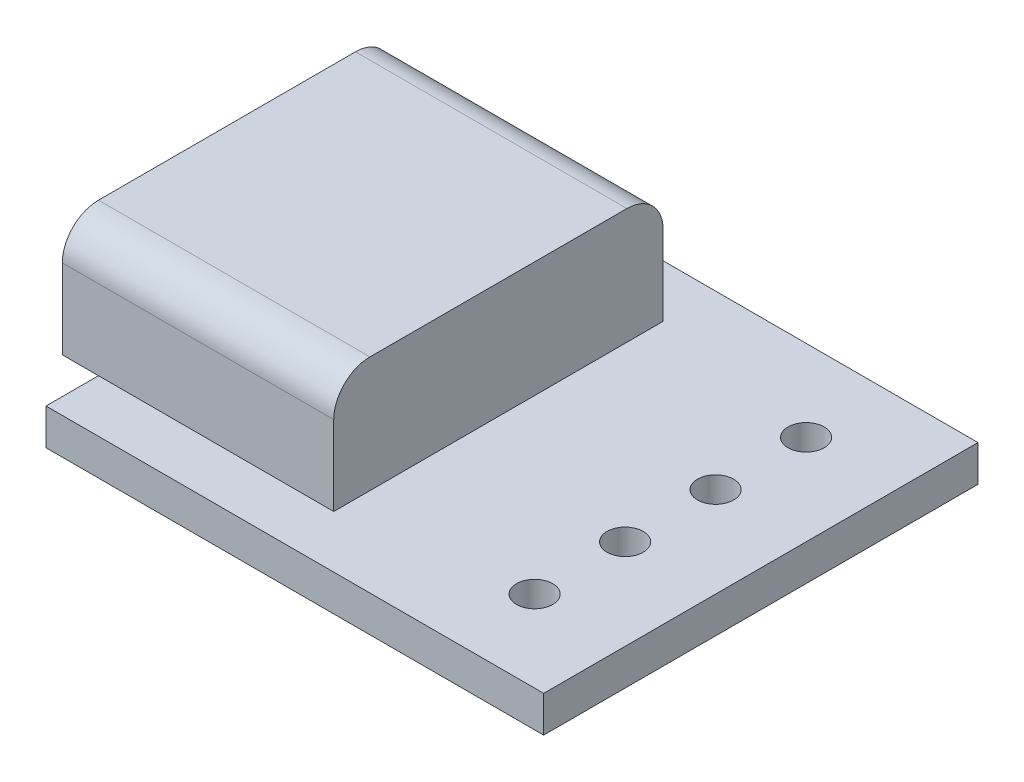
ISO-10303-21;
HEADER;
FILE_DESCRIPTION(('STEP AP214'),'2;1');
FILE_NAME('part.step','',(''),(''),'','','');
FILE_SCHEMA(('AUTOMOTIVE_DESIGN { 1 0 10303 214 1 1 1 1 }'));
ENDSEC;
DATA;
#1=APPLICATION_CONTEXT('core data for automotive mechanical design processes');
#2=APPLICATION_PROTOCOL_DEFINITION('international standard','automotive_design',2000,#1);
#3=PRODUCT_CONTEXT('',#1,'mechanical');
#4=PRODUCT('Part','Part','',(#3));
#5=PRODUCT_RELATED_PRODUCT_CATEGORY('part','',(#4));
#6=PRODUCT_DEFINITION_FORMATION('','',#4);
#7=PRODUCT_DEFINITION_CONTEXT('part definition',#1,'design');
#8=PRODUCT_DEFINITION('design','',#6,#7);
#9=PRODUCT_DEFINITION_SHAPE('','',#8);
#10=(LENGTH_UNIT() NAMED_UNIT(*) SI_UNIT(.MILLI.,.METRE.));
#11=(NAMED_UNIT(*) PLANE_ANGLE_UNIT() SI_UNIT($,.RADIAN.));
#12=(NAMED_UNIT(*) SI_UNIT($,.STERADIAN.) SOLID_ANGLE_UNIT());
#13=UNCERTAINTY_MEASURE_WITH_UNIT(LENGTH_MEASURE(1.E-05),#10,'distance_accuracy_value','');
#14=(GEOMETRIC_REPRESENTATION_CONTEXT(3) GLOBAL_UNCERTAINTY_ASSIGNED_CONTEXT((#13)) GLOBAL_UNIT_ASSIGNED_CONTEXT((#10,
#11,#12)) REPRESENTATION_CONTEXT('',''));
#15=CARTESIAN_POINT('',(0.,0.,0.));
#16=DIRECTION('',(0.,0.,1.));
#17=DIRECTION('',(1.,0.,0.));
#18=AXIS2_PLACEMENT_3D('',#15,#16,#17);
#19=CARTESIAN_POINT('',(0.,1.,-12.));
#20=DIRECTION('',(0.,0.,-1.));
#21=DIRECTION('',(-1.,0.,0.));
#22=AXIS2_PLACEMENT_3D('',#19,#20,#21);
#23=PLANE('',#22);
#24=DIRECTION('',(1.,0.,0.));
#25=VECTOR('',#24,1.);
#26=CARTESIAN_POINT('',(0.,0.,-12.));
#27=LINE('',#26,#25);
#28=CARTESIAN_POINT('',(0.,0.,-12.));
#29=VERTEX_POINT('',#28);
#30=CARTESIAN_POINT('',(13.75,0.,-12.));
#31=VERTEX_POINT('',#30);
#32=EDGE_CURVE('E161',#29,#31,#27,.T.);
#33=ORIENTED_EDGE('',*,*,#32,.F.);
#34=DIRECTION('',(0.,-1.,0.));
#35=VECTOR('',#34,1.);
#36=CARTESIAN_POINT('',(0.,1.,-12.));
#37=LINE('',#36,#35);
#38=CARTESIAN_POINT('',(0.,1.,-12.));
#39=VERTEX_POINT('',#38);
#40=EDGE_CURVE('E141',#39,#29,#37,.T.);
#41=ORIENTED_EDGE('',*,*,#40,.F.);
#42=DIRECTION('',(1.,0.,0.));
#43=VECTOR('',#42,1.);
#44=CARTESIAN_POINT('',(0.,1.,-12.));
#45=LINE('',#44,#43);
#46=CARTESIAN_POINT('',(13.75,1.,-12.));
#47=VERTEX_POINT('',#46);
#48=EDGE_CURVE('E162',#39,#47,#45,.T.);
#49=ORIENTED_EDGE('',*,*,#48,.T.);
#50=DIRECTION('',(0.,-1.,0.));
#51=VECTOR('',#50,1.);
#52=CARTESIAN_POINT('',(13.75,1.,-12.));
#53=LINE('',#52,#51);
#54=EDGE_CURVE('E186',#47,#31,#53,.T.);
#55=ORIENTED_EDGE('',*,*,#54,.T.);
#56=EDGE_LOOP('',(#33,#41,#49,#55));
#57=FACE_BOUND('',#56,.T.);
#58=ADVANCED_FACE('F34',(#57),#23,.T.);
#59=CARTESIAN_POINT('',(0.,1.,0.));
#60=DIRECTION('',(-1.,0.,0.));
#61=DIRECTION('',(0.,0.,1.));
#62=AXIS2_PLACEMENT_3D('',#59,#60,#61);
#63=PLANE('',#62);
#64=DIRECTION('',(0.,0.,-1.));
#65=VECTOR('',#64,1.);
#66=CARTESIAN_POINT('',(0.,0.,0.));
#67=LINE('',#66,#65);
#68=CARTESIAN_POINT('',(0.,0.,0.));
#69=VERTEX_POINT('',#68);
#70=EDGE_CURVE('E189',#69,#29,#67,.T.);
#71=ORIENTED_EDGE('',*,*,#70,.F.);
#72=DIRECTION('',(0.,-1.,0.));
#73=VECTOR('',#72,1.);
#74=CARTESIAN_POINT('',(0.,1.,0.));
#75=LINE('',#74,#73);
#76=CARTESIAN_POINT('',(0.,1.,0.));
#77=VERTEX_POINT('',#76);
#78=EDGE_CURVE('E212',#77,#69,#75,.T.);
#79=ORIENTED_EDGE('',*,*,#78,.F.);
#80=DIRECTION('',(0.,0.,-1.));
#81=VECTOR('',#80,1.);
#82=CARTESIAN_POINT('',(0.,1.,0.));
#83=LINE('',#82,#81);
#84=CARTESIAN_POINT('',(0.,1.,-1.45));
#85=VERTEX_POINT('',#84);
#86=EDGE_CURVE('E166',#77,#85,#83,.T.);
#87=ORIENTED_EDGE('',*,*,#86,.T.);
#88=CARTESIAN_POINT('',(0.,1.,-10.55));
#89=VERTEX_POINT('',#88);
#90=EDGE_CURVE('E170',#85,#89,#83,.T.);
#91=ORIENTED_EDGE('',*,*,#90,.T.);
#92=EDGE_CURVE('E138',#89,#39,#83,.T.);
#93=ORIENTED_EDGE('',*,*,#92,.T.);
#94=ORIENTED_EDGE('',*,*,#40,.T.);
#95=EDGE_LOOP('',(#71,#79,#87,#91,#93,#94));
#96=FACE_BOUND('',#95,.T.);
#97=ADVANCED_FACE('F242',(#96),#63,.T.);
#98=CARTESIAN_POINT('',(0.,1.,0.));
#99=DIRECTION('',(0.,0.,-1.));
#100=DIRECTION('',(-1.,0.,0.));
#101=AXIS2_PLACEMENT_3D('',#98,#99,#100);
#102=PLANE('',#101);
#103=DIRECTION('',(1.,0.,0.));
#104=VECTOR('',#103,1.);
#105=CARTESIAN_POINT('',(0.,0.,0.));
#106=LINE('',#105,#104);
#107=CARTESIAN_POINT('',(13.75,0.,0.));
#108=VERTEX_POINT('',#107);
#109=EDGE_CURVE('E192',#69,#108,#106,.T.);
#110=ORIENTED_EDGE('',*,*,#109,.T.);
#111=DIRECTION('',(0.,-1.,0.));
#112=VECTOR('',#111,1.);
#113=CARTESIAN_POINT('',(13.75,1.,0.));
#114=LINE('',#113,#112);
#115=CARTESIAN_POINT('',(13.75,1.,0.));
#116=VERTEX_POINT('',#115);
#117=EDGE_CURVE('E209',#116,#108,#114,.T.);
#118=ORIENTED_EDGE('',*,*,#117,.F.);
#119=DIRECTION('',(1.,0.,0.));
#120=VECTOR('',#119,1.);
#121=CARTESIAN_POINT('',(0.,1.,0.));
#122=LINE('',#121,#120);
#123=EDGE_CURVE('E169',#77,#116,#122,.T.);
#124=ORIENTED_EDGE('',*,*,#123,.F.);
#125=ORIENTED_EDGE('',*,*,#78,.T.);
#126=EDGE_LOOP('',(#110,#118,#124,#125));
#127=FACE_BOUND('',#126,.T.);
#128=ADVANCED_FACE('F260',(#127),#102,.F.);
#129=CARTESIAN_POINT('',(11.25,1.,-7.25));
#130=DIRECTION('',(0.,-1.,0.));
#131=DIRECTION('',(0.,0.,-1.));
#132=AXIS2_PLACEMENT_3D('',#129,#130,#131);
#133=CYLINDRICAL_SURFACE('',#132,0.500000000000001);
#134=CARTESIAN_POINT('',(11.25,1.,-7.25));
#135=DIRECTION('',(0.,1.,0.));
#136=DIRECTION('',(0.,0.,1.));
#137=AXIS2_PLACEMENT_3D('',#134,#135,#136);
#138=CIRCLE('',#137,0.500000000000001);
#139=CARTESIAN_POINT('',(11.25,1.,-6.75));
#140=VERTEX_POINT('',#139);
#141=EDGE_CURVE('E180',#140,#140,#138,.T.);
#142=ORIENTED_EDGE('',*,*,#141,.T.);
#143=EDGE_LOOP('',(#142));
#144=FACE_BOUND('',#143,.T.);
#145=CARTESIAN_POINT('',(11.25,0.,-7.25));
#146=DIRECTION('',(0.,1.,0.));
#147=DIRECTION('',(0.,0.,1.));
#148=AXIS2_PLACEMENT_3D('',#145,#146,#147);
#149=CIRCLE('',#148,0.500000000000001);
#150=CARTESIAN_POINT('',(11.25,0.,-6.75));
#151=VERTEX_POINT('',#150);
#152=EDGE_CURVE('E203',#151,#151,#149,.T.);
#153=ORIENTED_EDGE('',*,*,#152,.F.);
#154=EDGE_LOOP('',(#153));
#155=FACE_BOUND('',#154,.T.);
#156=ADVANCED_FACE('F262',(#144,#155),#133,.F.);
#157=CARTESIAN_POINT('',(11.2500000000001,1.,-4.75));
#158=DIRECTION('',(0.,-1.,0.));
#159=DIRECTION('',(0.,0.,-1.));
#160=AXIS2_PLACEMENT_3D('',#157,#158,#159);
#161=CYLINDRICAL_SURFACE('',#160,0.500000000000001);
#162=CARTESIAN_POINT('',(11.2500000000001,1.,-4.75));
#163=DIRECTION('',(0.,1.,0.));
#164=DIRECTION('',(0.,0.,1.));
#165=AXIS2_PLACEMENT_3D('',#162,#163,#164);
#166=CIRCLE('',#165,0.500000000000001);
#167=CARTESIAN_POINT('',(11.2500000000001,1.,-4.25));
#168=VERTEX_POINT('',#167);
#169=EDGE_CURVE('E177',#168,#168,#166,.T.);
#170=ORIENTED_EDGE('',*,*,#169,.T.);
#171=EDGE_LOOP('',(#170));
#172=FACE_BOUND('',#171,.T.);
#173=CARTESIAN_POINT('',(11.2500000000001,0.,-4.75));
#174=DIRECTION('',(0.,1.,0.));
#175=DIRECTION('',(0.,0.,1.));
#176=AXIS2_PLACEMENT_3D('',#173,#174,#175);
#177=CIRCLE('',#176,0.500000000000001);
#178=CARTESIAN_POINT('',(11.2500000000001,0.,-4.25));
#179=VERTEX_POINT('',#178);
#180=EDGE_CURVE('E200',#179,#179,#177,.T.);
#181=ORIENTED_EDGE('',*,*,#180,.F.);
#182=EDGE_LOOP('',(#181));
#183=FACE_BOUND('',#182,.T.);
#184=ADVANCED_FACE('F268',(#172,#183),#161,.F.);
#185=CARTESIAN_POINT('',(11.2500000000001,1.,-2.25));
#186=DIRECTION('',(0.,-1.,0.));
#187=DIRECTION('',(0.,0.,-1.));
#188=AXIS2_PLACEMENT_3D('',#185,#186,#187);
#189=CYLINDRICAL_SURFACE('',#188,0.500000000000001);
#190=CARTESIAN_POINT('',(11.2500000000001,1.,-2.25));
#191=DIRECTION('',(0.,1.,0.));
#192=DIRECTION('',(0.,0.,1.));
#193=AXIS2_PLACEMENT_3D('',#190,#191,#192);
#194=CIRCLE('',#193,0.500000000000001);
#195=CARTESIAN_POINT('',(11.2500000000001,1.,-1.75));
#196=VERTEX_POINT('',#195);
#197=EDGE_CURVE('E174',#196,#196,#194,.T.);
#198=ORIENTED_EDGE('',*,*,#197,.T.);
#199=EDGE_LOOP('',(#198));
#200=FACE_BOUND('',#199,.T.);
#201=CARTESIAN_POINT('',(11.2500000000001,0.,-2.25));
#202=DIRECTION('',(0.,1.,0.));
#203=DIRECTION('',(0.,0.,1.));
#204=AXIS2_PLACEMENT_3D('',#201,#202,#203);
#205=CIRCLE('',#204,0.500000000000001);
#206=CARTESIAN_POINT('',(11.2500000000001,0.,-1.75));
#207=VERTEX_POINT('',#206);
#208=EDGE_CURVE('E197',#207,#207,#205,.T.);
#209=ORIENTED_EDGE('',*,*,#208,.F.);
#210=EDGE_LOOP('',(#209));
#211=FACE_BOUND('',#210,.T.);
#212=ADVANCED_FACE('F307',(#200,#211),#189,.F.);
#213=CARTESIAN_POINT('',(13.75,1.,0.));
#214=DIRECTION('',(-1.,0.,0.));
#215=DIRECTION('',(0.,0.,1.));
#216=AXIS2_PLACEMENT_3D('',#213,#214,#215);
#217=PLANE('',#216);
#218=DIRECTION('',(0.,0.,-1.));
#219=VECTOR('',#218,1.);
#220=CARTESIAN_POINT('',(13.75,0.,0.));
#221=LINE('',#220,#219);
#222=EDGE_CURVE('E194',#108,#31,#221,.T.);
#223=ORIENTED_EDGE('',*,*,#222,.T.);
#224=ORIENTED_EDGE('',*,*,#54,.F.);
#225=DIRECTION('',(0.,0.,-1.));
#226=VECTOR('',#225,1.);
#227=CARTESIAN_POINT('',(13.75,1.,0.));
#228=LINE('',#227,#226);
#229=EDGE_CURVE('E172',#116,#47,#228,.T.);
#230=ORIENTED_EDGE('',*,*,#229,.F.);
#231=ORIENTED_EDGE('',*,*,#117,.T.);
#232=EDGE_LOOP('',(#223,#224,#230,#231));
#233=FACE_BOUND('',#232,.T.);
#234=ADVANCED_FACE('F253',(#233),#217,.F.);
#235=CARTESIAN_POINT('',(11.25,1.,-9.75));
#236=DIRECTION('',(0.,-1.,0.));
#237=DIRECTION('',(0.,0.,-1.));
#238=AXIS2_PLACEMENT_3D('',#235,#236,#237);
#239=CYLINDRICAL_SURFACE('',#238,0.500000000000001);
#240=CARTESIAN_POINT('',(11.25,1.,-9.75));
#241=DIRECTION('',(0.,1.,0.));
#242=DIRECTION('',(0.,0.,1.));
#243=AXIS2_PLACEMENT_3D('',#240,#241,#242);
#244=CIRCLE('',#243,0.500000000000001);
#245=CARTESIAN_POINT('',(11.25,1.,-9.25));
#246=VERTEX_POINT('',#245);
#247=EDGE_CURVE('E183',#246,#246,#244,.T.);
#248=ORIENTED_EDGE('',*,*,#247,.T.);
#249=EDGE_LOOP('',(#248));
#250=FACE_BOUND('',#249,.T.);
#251=CARTESIAN_POINT('',(11.25,0.,-9.75));
#252=DIRECTION('',(0.,1.,0.));
#253=DIRECTION('',(0.,0.,1.));
#254=AXIS2_PLACEMENT_3D('',#251,#252,#253);
#255=CIRCLE('',#254,0.500000000000001);
#256=CARTESIAN_POINT('',(11.25,0.,-9.25));
#257=VERTEX_POINT('',#256);
#258=EDGE_CURVE('E165',#257,#257,#255,.T.);
#259=ORIENTED_EDGE('',*,*,#258,.F.);
#260=EDGE_LOOP('',(#259));
#261=FACE_BOUND('',#260,.T.);
#262=ADVANCED_FACE('F299',(#250,#261),#239,.F.);
#263=CARTESIAN_POINT('',(0.,1.,0.));
#264=DIRECTION('',(0.,1.,0.));
#265=DIRECTION('',(0.,0.,1.));
#266=AXIS2_PLACEMENT_3D('',#263,#264,#265);
#267=PLANE('',#266);
#268=DIRECTION('',(1.,0.,0.));
#269=VECTOR('',#268,1.);
#270=CARTESIAN_POINT('',(0.,1.,-1.45));
#271=LINE('',#270,#269);
#272=CARTESIAN_POINT('',(6.5,1.,-1.45));
#273=VERTEX_POINT('',#272);
#274=EDGE_CURVE('E140',#85,#273,#271,.T.);
#275=ORIENTED_EDGE('',*,*,#274,.F.);
#276=ORIENTED_EDGE('',*,*,#86,.F.);
#277=ORIENTED_EDGE('',*,*,#123,.T.);
#278=ORIENTED_EDGE('',*,*,#229,.T.);
#279=ORIENTED_EDGE('',*,*,#48,.F.);
#280=ORIENTED_EDGE('',*,*,#92,.F.);
#281=DIRECTION('',(1.,0.,0.));
#282=VECTOR('',#281,1.);
#283=CARTESIAN_POINT('',(0.,1.,-10.55));
#284=LINE('',#283,#282);
#285=CARTESIAN_POINT('',(6.5,1.,-10.55));
#286=VERTEX_POINT('',#285);
#287=EDGE_CURVE('E123',#89,#286,#284,.T.);
#288=ORIENTED_EDGE('',*,*,#287,.T.);
#289=DIRECTION('',(0.,0.,-1.));
#290=VECTOR('',#289,1.);
#291=CARTESIAN_POINT('',(6.5,1.,0.));
#292=LINE('',#291,#290);
#293=EDGE_CURVE('E135',#273,#286,#292,.T.);
#294=ORIENTED_EDGE('',*,*,#293,.F.);
#295=EDGE_LOOP('',(#275,#276,#277,#278,#279,#280,#288,#294));
#296=FACE_BOUND('',#295,.T.);
#297=ORIENTED_EDGE('',*,*,#197,.F.);
#298=EDGE_LOOP('',(#297));
#299=FACE_BOUND('',#298,.T.);
#300=ORIENTED_EDGE('',*,*,#169,.F.);
#301=EDGE_LOOP('',(#300));
#302=FACE_BOUND('',#301,.T.);
#303=ORIENTED_EDGE('',*,*,#141,.F.);
#304=EDGE_LOOP('',(#303));
#305=FACE_BOUND('',#304,.T.);
#306=ORIENTED_EDGE('',*,*,#247,.F.);
#307=EDGE_LOOP('',(#306));
#308=FACE_BOUND('',#307,.T.);
#309=ADVANCED_FACE('F133',(#296,#299,#302,#305,#308),#267,.T.);
#310=CARTESIAN_POINT('',(0.,0.,0.));
#311=DIRECTION('',(0.,1.,0.));
#312=DIRECTION('',(0.,0.,1.));
#313=AXIS2_PLACEMENT_3D('',#310,#311,#312);
#314=PLANE('',#313);
#315=ORIENTED_EDGE('',*,*,#32,.T.);
#316=ORIENTED_EDGE('',*,*,#222,.F.);
#317=ORIENTED_EDGE('',*,*,#109,.F.);
#318=ORIENTED_EDGE('',*,*,#70,.T.);
#319=EDGE_LOOP('',(#315,#316,#317,#318));
#320=FACE_BOUND('',#319,.T.);
#321=ORIENTED_EDGE('',*,*,#208,.T.);
#322=EDGE_LOOP('',(#321));
#323=FACE_BOUND('',#322,.T.);
#324=ORIENTED_EDGE('',*,*,#180,.T.);
#325=EDGE_LOOP('',(#324));
#326=FACE_BOUND('',#325,.T.);
#327=ORIENTED_EDGE('',*,*,#152,.T.);
#328=EDGE_LOOP('',(#327));
#329=FACE_BOUND('',#328,.T.);
#330=ORIENTED_EDGE('',*,*,#258,.T.);
#331=EDGE_LOOP('',(#330));
#332=FACE_BOUND('',#331,.T.);
#333=ADVANCED_FACE('F257',(#320,#323,#326,#329,#332),#314,.F.);
#334=CARTESIAN_POINT('',(0.,4.2,-1.45));
#335=DIRECTION('',(0.,0.,-1.));
#336=DIRECTION('',(-1.,0.,0.));
#337=AXIS2_PLACEMENT_3D('',#334,#335,#336);
#338=PLANE('',#337);
#339=DIRECTION('',(0.,-1.,0.));
#340=VECTOR('',#339,1.);
#341=CARTESIAN_POINT('',(6.5,4.2,-1.45));
#342=LINE('',#341,#340);
#343=CARTESIAN_POINT('',(6.5,3.2,-1.45));
#344=VERTEX_POINT('',#343);
#345=EDGE_CURVE('E128',#344,#273,#342,.T.);
#346=ORIENTED_EDGE('',*,*,#345,.F.);
#347=DIRECTION('',(1.,0.,0.));
#348=VECTOR('',#347,1.);
#349=CARTESIAN_POINT('',(-1.,3.2,-1.45));
#350=LINE('',#349,#348);
#351=CARTESIAN_POINT('',(-1.,3.2,-1.45));
#352=VERTEX_POINT('',#351);
#353=EDGE_CURVE('E57',#344,#352,#350,.F.);
#354=ORIENTED_EDGE('',*,*,#353,.T.);
#355=DIRECTION('',(0.,-1.,0.));
#356=VECTOR('',#355,1.);
#357=CARTESIAN_POINT('',(-1.,4.2,-1.45));
#358=LINE('',#357,#356);
#359=CARTESIAN_POINT('',(-1.,1.,-1.45));
#360=VERTEX_POINT('',#359);
#361=EDGE_CURVE('E156',#352,#360,#358,.T.);
#362=ORIENTED_EDGE('',*,*,#361,.T.);
#363=EDGE_CURVE('E146',#360,#85,#271,.T.);
#364=ORIENTED_EDGE('',*,*,#363,.T.);
#365=ORIENTED_EDGE('',*,*,#274,.T.);
#366=EDGE_LOOP('',(#346,#354,#362,#364,#365));
#367=FACE_BOUND('',#366,.T.);
#368=ADVANCED_FACE('F236',(#367),#338,.F.);
#369=CARTESIAN_POINT('',(6.5,4.2,0.));
#370=DIRECTION('',(-1.,0.,0.));
#371=DIRECTION('',(0.,0.,1.));
#372=AXIS2_PLACEMENT_3D('',#369,#370,#371);
#373=PLANE('',#372);
#374=DIRECTION('',(0.,0.,-1.));
#375=VECTOR('',#374,1.);
#376=CARTESIAN_POINT('',(6.5,4.2,0.));
#377=LINE('',#376,#375);
#378=CARTESIAN_POINT('',(6.5,4.2,-2.45));
#379=VERTEX_POINT('',#378);
#380=CARTESIAN_POINT('',(6.5,4.2,-9.55));
#381=VERTEX_POINT('',#380);
#382=EDGE_CURVE('E155',#379,#381,#377,.T.);
#383=ORIENTED_EDGE('',*,*,#382,.F.);
#384=CARTESIAN_POINT('',(6.5,3.2,-2.45));
#385=DIRECTION('',(-1.,0.,0.));
#386=DIRECTION('',(0.,0.,1.));
#387=AXIS2_PLACEMENT_3D('',#384,#385,#386);
#388=CIRCLE('',#387,1.);
#389=EDGE_CURVE('E222',#379,#344,#388,.F.);
#390=ORIENTED_EDGE('',*,*,#389,.T.);
#391=ORIENTED_EDGE('',*,*,#345,.T.);
#392=ORIENTED_EDGE('',*,*,#293,.T.);
#393=DIRECTION('',(0.,-1.,0.));
#394=VECTOR('',#393,1.);
#395=CARTESIAN_POINT('',(6.5,4.2,-10.55));
#396=LINE('',#395,#394);
#397=CARTESIAN_POINT('',(6.5,3.2,-10.55));
#398=VERTEX_POINT('',#397);
#399=EDGE_CURVE('E119',#398,#286,#396,.T.);
#400=ORIENTED_EDGE('',*,*,#399,.F.);
#401=CARTESIAN_POINT('',(6.5,3.2,-9.55));
#402=DIRECTION('',(-1.,0.,0.));
#403=DIRECTION('',(0.,0.,1.));
#404=AXIS2_PLACEMENT_3D('',#401,#402,#403);
#405=CIRCLE('',#404,1.);
#406=EDGE_CURVE('E220',#398,#381,#405,.F.);
#407=ORIENTED_EDGE('',*,*,#406,.T.);
#408=EDGE_LOOP('',(#383,#390,#391,#392,#400,#407));
#409=FACE_BOUND('',#408,.T.);
#410=ADVANCED_FACE('F145',(#409),#373,.F.);
#411=CARTESIAN_POINT('',(0.,4.2,-10.55));
#412=DIRECTION('',(0.,0.,-1.));
#413=DIRECTION('',(-1.,0.,0.));
#414=AXIS2_PLACEMENT_3D('',#411,#412,#413);
#415=PLANE('',#414);
#416=DIRECTION('',(0.,-1.,0.));
#417=VECTOR('',#416,1.);
#418=CARTESIAN_POINT('',(-1.,4.2,-10.55));
#419=LINE('',#418,#417);
#420=CARTESIAN_POINT('',(-1.,3.2,-10.55));
#421=VERTEX_POINT('',#420);
#422=CARTESIAN_POINT('',(-1.,1.,-10.55));
#423=VERTEX_POINT('',#422);
#424=EDGE_CURVE('E129',#421,#423,#419,.T.);
#425=ORIENTED_EDGE('',*,*,#424,.F.);
#426=DIRECTION('',(1.,0.,0.));
#427=VECTOR('',#426,1.);
#428=CARTESIAN_POINT('',(0.,3.2,-10.55));
#429=LINE('',#428,#427);
#430=EDGE_CURVE('E11',#421,#398,#429,.T.);
#431=ORIENTED_EDGE('',*,*,#430,.T.);
#432=ORIENTED_EDGE('',*,*,#399,.T.);
#433=ORIENTED_EDGE('',*,*,#287,.F.);
#434=EDGE_CURVE('E143',#423,#89,#284,.T.);
#435=ORIENTED_EDGE('',*,*,#434,.F.);
#436=EDGE_LOOP('',(#425,#431,#432,#433,#435));
#437=FACE_BOUND('',#436,.T.);
#438=ADVANCED_FACE('F121',(#437),#415,.T.);
#439=CARTESIAN_POINT('',(-1.,4.2,0.));
#440=DIRECTION('',(-1.,0.,0.));
#441=DIRECTION('',(0.,0.,1.));
#442=AXIS2_PLACEMENT_3D('',#439,#440,#441);
#443=PLANE('',#442);
#444=ORIENTED_EDGE('',*,*,#361,.F.);
#445=CARTESIAN_POINT('',(-1.,3.2,-2.45));
#446=DIRECTION('',(-1.,0.,0.));
#447=DIRECTION('',(0.,0.,1.));
#448=AXIS2_PLACEMENT_3D('',#445,#446,#447);
#449=CIRCLE('',#448,1.);
#450=CARTESIAN_POINT('',(-1.,4.2,-2.45));
#451=VERTEX_POINT('',#450);
#452=EDGE_CURVE('E42',#352,#451,#449,.T.);
#453=ORIENTED_EDGE('',*,*,#452,.T.);
#454=DIRECTION('',(0.,0.,-1.));
#455=VECTOR('',#454,1.);
#456=CARTESIAN_POINT('',(-1.,4.2,0.));
#457=LINE('',#456,#455);
#458=CARTESIAN_POINT('',(-1.,4.2,-9.55));
#459=VERTEX_POINT('',#458);
#460=EDGE_CURVE('E158',#451,#459,#457,.T.);
#461=ORIENTED_EDGE('',*,*,#460,.T.);
#462=CARTESIAN_POINT('',(-1.,3.2,-9.55));
#463=DIRECTION('',(-1.,0.,0.));
#464=DIRECTION('',(0.,0.,1.));
#465=AXIS2_PLACEMENT_3D('',#462,#463,#464);
#466=CIRCLE('',#465,1.);
#467=EDGE_CURVE('E49',#459,#421,#466,.T.);
#468=ORIENTED_EDGE('',*,*,#467,.T.);
#469=ORIENTED_EDGE('',*,*,#424,.T.);
#470=DIRECTION('',(0.,0.,-1.));
#471=VECTOR('',#470,1.);
#472=CARTESIAN_POINT('',(-1.,1.,0.));
#473=LINE('',#472,#471);
#474=EDGE_CURVE('E148',#360,#423,#473,.T.);
#475=ORIENTED_EDGE('',*,*,#474,.F.);
#476=EDGE_LOOP('',(#444,#453,#461,#468,#469,#475));
#477=FACE_BOUND('',#476,.T.);
#478=ADVANCED_FACE('F227',(#477),#443,.T.);
#479=CARTESIAN_POINT('',(0.,4.2,0.));
#480=DIRECTION('',(0.,1.,0.));
#481=DIRECTION('',(0.,0.,1.));
#482=AXIS2_PLACEMENT_3D('',#479,#480,#481);
#483=PLANE('',#482);
#484=ORIENTED_EDGE('',*,*,#460,.F.);
#485=DIRECTION('',(1.,0.,0.));
#486=VECTOR('',#485,1.);
#487=CARTESIAN_POINT('',(6.5,4.2,-2.45));
#488=LINE('',#487,#486);
#489=EDGE_CURVE('E217',#451,#379,#488,.T.);
#490=ORIENTED_EDGE('',*,*,#489,.T.);
#491=ORIENTED_EDGE('',*,*,#382,.T.);
#492=DIRECTION('',(1.,0.,0.));
#493=VECTOR('',#492,1.);
#494=CARTESIAN_POINT('',(0.,4.2,-9.55));
#495=LINE('',#494,#493);
#496=EDGE_CURVE('E215',#381,#459,#495,.F.);
#497=ORIENTED_EDGE('',*,*,#496,.T.);
#498=EDGE_LOOP('',(#484,#490,#491,#497));
#499=FACE_BOUND('',#498,.T.);
#500=ADVANCED_FACE('F232',(#499),#483,.T.);
#501=CARTESIAN_POINT('',(0.,1.,0.));
#502=DIRECTION('',(0.,1.,0.));
#503=DIRECTION('',(0.,0.,1.));
#504=AXIS2_PLACEMENT_3D('',#501,#502,#503);
#505=PLANE('',#504);
#506=ORIENTED_EDGE('',*,*,#90,.F.);
#507=ORIENTED_EDGE('',*,*,#363,.F.);
#508=ORIENTED_EDGE('',*,*,#474,.T.);
#509=ORIENTED_EDGE('',*,*,#434,.T.);
#510=EDGE_LOOP('',(#506,#507,#508,#509));
#511=FACE_BOUND('',#510,.T.);
#512=ADVANCED_FACE('F245',(#511),#505,.F.);
#513=CARTESIAN_POINT('',(0.,3.2,-2.45));
#514=DIRECTION('',(-1.,0.,0.));
#515=DIRECTION('',(0.,0.,1.));
#516=AXIS2_PLACEMENT_3D('',#513,#514,#515);
#517=CYLINDRICAL_SURFACE('',#516,1.);
#518=ORIENTED_EDGE('',*,*,#452,.F.);
#519=ORIENTED_EDGE('',*,*,#353,.F.);
#520=ORIENTED_EDGE('',*,*,#389,.F.);
#521=ORIENTED_EDGE('',*,*,#489,.F.);
#522=EDGE_LOOP('',(#518,#519,#520,#521));
#523=FACE_BOUND('',#522,.T.);
#524=ADVANCED_FACE('F235',(#523),#517,.T.);
#525=CARTESIAN_POINT('',(0.,3.2,-9.55));
#526=DIRECTION('',(1.,0.,0.));
#527=DIRECTION('',(0.,0.,-1.));
#528=AXIS2_PLACEMENT_3D('',#525,#526,#527);
#529=CYLINDRICAL_SURFACE('',#528,1.);
#530=ORIENTED_EDGE('',*,*,#467,.F.);
#531=ORIENTED_EDGE('',*,*,#496,.F.);
#532=ORIENTED_EDGE('',*,*,#406,.F.);
#533=ORIENTED_EDGE('',*,*,#430,.F.);
#534=EDGE_LOOP('',(#530,#531,#532,#533));
#535=FACE_BOUND('',#534,.T.);
#536=ADVANCED_FACE('F36',(#535),#529,.T.);
#537=CLOSED_SHELL('',(#58,#97,#128,#156,#184,#212,#234,#262,#309,#333,#368,#410,#438,#478,#500,
#512,#524,#536));
#538=MANIFOLD_SOLID_BREP('B2',#537);
#539=ADVANCED_BREP_SHAPE_REPRESENTATION('',(#18,#538),#14);
#540=SHAPE_DEFINITION_REPRESENTATION(#9,#539);
ENDSEC;
END-ISO-10303-21;
